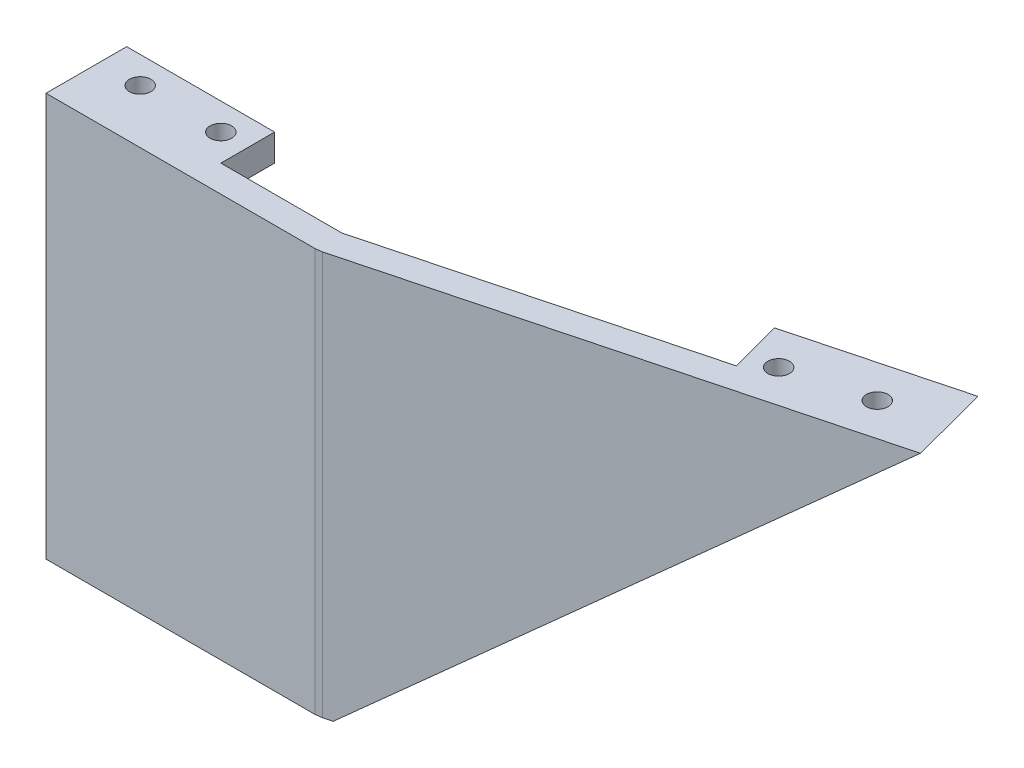
ISO-10303-21;
HEADER;
FILE_DESCRIPTION(('STEP AP214'),'2;1');
FILE_NAME('part.step','',(''),(''),'','','');
FILE_SCHEMA(('AUTOMOTIVE_DESIGN { 1 0 10303 214 1 1 1 1 }'));
ENDSEC;
DATA;
#1=APPLICATION_CONTEXT('core data for automotive mechanical design processes');
#2=APPLICATION_PROTOCOL_DEFINITION('international standard','automotive_design',2000,#1);
#3=PRODUCT_CONTEXT('',#1,'mechanical');
#4=PRODUCT('Part','Part','',(#3));
#5=PRODUCT_RELATED_PRODUCT_CATEGORY('part','',(#4));
#6=PRODUCT_DEFINITION_FORMATION('','',#4);
#7=PRODUCT_DEFINITION_CONTEXT('part definition',#1,'design');
#8=PRODUCT_DEFINITION('design','',#6,#7);
#9=PRODUCT_DEFINITION_SHAPE('','',#8);
#10=(LENGTH_UNIT() NAMED_UNIT(*) SI_UNIT(.MILLI.,.METRE.));
#11=(NAMED_UNIT(*) PLANE_ANGLE_UNIT() SI_UNIT($,.RADIAN.));
#12=(NAMED_UNIT(*) SI_UNIT($,.STERADIAN.) SOLID_ANGLE_UNIT());
#13=UNCERTAINTY_MEASURE_WITH_UNIT(LENGTH_MEASURE(1.E-05),#10,'distance_accuracy_value','');
#14=(GEOMETRIC_REPRESENTATION_CONTEXT(3) GLOBAL_UNCERTAINTY_ASSIGNED_CONTEXT((#13)) GLOBAL_UNIT_ASSIGNED_CONTEXT((#10,
#11,#12)) REPRESENTATION_CONTEXT('',''));
#15=CARTESIAN_POINT('',(0.,0.,0.));
#16=DIRECTION('',(0.,0.,1.));
#17=DIRECTION('',(1.,0.,0.));
#18=AXIS2_PLACEMENT_3D('',#15,#16,#17);
#19=CARTESIAN_POINT('',(0.,65.,0.));
#20=DIRECTION('',(0.,-1.,0.));
#21=DIRECTION('',(0.,0.,-1.));
#22=AXIS2_PLACEMENT_3D('',#19,#20,#21);
#23=PLANE('',#22);
#24=DIRECTION('',(0.,0.,1.));
#25=VECTOR('',#24,1.);
#26=CARTESIAN_POINT('',(-19.9999999999999,65.,-20.));
#27=LINE('',#26,#25);
#28=CARTESIAN_POINT('',(-19.9999999999999,65.,-20.));
#29=VERTEX_POINT('',#28);
#30=CARTESIAN_POINT('',(-19.9999999999999,65.,0.));
#31=VERTEX_POINT('',#30);
#32=EDGE_CURVE('E147',#29,#31,#27,.T.);
#33=ORIENTED_EDGE('',*,*,#32,.T.);
#34=DIRECTION('',(1.,0.,0.));
#35=VECTOR('',#34,1.);
#36=CARTESIAN_POINT('',(-25.,65.,0.));
#37=LINE('',#36,#35);
#38=CARTESIAN_POINT('',(-75.,65.,0.));
#39=VERTEX_POINT('',#38);
#40=EDGE_CURVE('E162',#39,#31,#37,.T.);
#41=ORIENTED_EDGE('',*,*,#40,.F.);
#42=DIRECTION('',(0.,0.,1.));
#43=VECTOR('',#42,1.);
#44=CARTESIAN_POINT('',(-75.,65.,-20.));
#45=LINE('',#44,#43);
#46=CARTESIAN_POINT('',(-75.,65.,-20.));
#47=VERTEX_POINT('',#46);
#48=EDGE_CURVE('E364',#47,#39,#45,.T.);
#49=ORIENTED_EDGE('',*,*,#48,.F.);
#50=DIRECTION('',(-1.,0.,0.));
#51=VECTOR('',#50,1.);
#52=CARTESIAN_POINT('',(-25.,65.,-20.));
#53=LINE('',#52,#51);
#54=EDGE_CURVE('E164',#29,#47,#53,.T.);
#55=ORIENTED_EDGE('',*,*,#54,.F.);
#56=EDGE_LOOP('',(#33,#41,#49,#55));
#57=FACE_BOUND('',#56,.T.);
#58=CARTESIAN_POINT('',(-30.,65.,-10.));
#59=DIRECTION('',(0.,-1.,0.));
#60=DIRECTION('',(0.,0.,-1.));
#61=AXIS2_PLACEMENT_3D('',#58,#59,#60);
#62=CIRCLE('',#61,4.);
#63=CARTESIAN_POINT('',(-30.,65.,-14.));
#64=VERTEX_POINT('',#63);
#65=EDGE_CURVE('E344',#64,#64,#62,.T.);
#66=ORIENTED_EDGE('',*,*,#65,.F.);
#67=EDGE_LOOP('',(#66));
#68=FACE_BOUND('',#67,.T.);
#69=CARTESIAN_POINT('',(-60.,65.,-10.));
#70=DIRECTION('',(0.,-1.,0.));
#71=DIRECTION('',(0.,0.,-1.));
#72=AXIS2_PLACEMENT_3D('',#69,#70,#71);
#73=CIRCLE('',#72,4.00000000000001);
#74=CARTESIAN_POINT('',(-60.,65.,-14.));
#75=VERTEX_POINT('',#74);
#76=EDGE_CURVE('E347',#75,#75,#73,.T.);
#77=ORIENTED_EDGE('',*,*,#76,.F.);
#78=EDGE_LOOP('',(#77));
#79=FACE_BOUND('',#78,.T.);
#80=ADVANCED_FACE('F46',(#57,#68,#79),#23,.T.);
#81=CARTESIAN_POINT('',(-25.,75.,10.));
#82=DIRECTION('',(0.,-1.,0.));
#83=DIRECTION('',(0.,0.,-1.));
#84=AXIS2_PLACEMENT_3D('',#81,#82,#83);
#85=PLANE('',#84);
#86=CARTESIAN_POINT('',(-60.,75.,-10.));
#87=DIRECTION('',(0.,-1.,0.));
#88=DIRECTION('',(0.,0.,-1.));
#89=AXIS2_PLACEMENT_3D('',#86,#87,#88);
#90=CIRCLE('',#89,4.00000000000001);
#91=CARTESIAN_POINT('',(-60.,75.,-14.));
#92=VERTEX_POINT('',#91);
#93=EDGE_CURVE('E361',#92,#92,#90,.T.);
#94=ORIENTED_EDGE('',*,*,#93,.T.);
#95=EDGE_LOOP('',(#94));
#96=FACE_BOUND('',#95,.T.);
#97=CARTESIAN_POINT('',(149.447223347746,75.,-37.919501592667));
#98=DIRECTION('',(0.,-1.,0.));
#99=DIRECTION('',(0.,0.,-1.));
#100=AXIS2_PLACEMENT_3D('',#97,#98,#99);
#101=CIRCLE('',#100,3.99999999999999);
#102=CARTESIAN_POINT('',(149.447223347746,75.,-41.919501592667));
#103=VERTEX_POINT('',#102);
#104=EDGE_CURVE('E358',#103,#103,#101,.T.);
#105=ORIENTED_EDGE('',*,*,#104,.T.);
#106=EDGE_LOOP('',(#105));
#107=FACE_BOUND('',#106,.T.);
#108=CARTESIAN_POINT('',(178.459459465625,75.,-45.5543005710563));
#109=DIRECTION('',(0.,-1.,0.));
#110=DIRECTION('',(0.,0.,-1.));
#111=AXIS2_PLACEMENT_3D('',#108,#109,#110);
#112=CIRCLE('',#111,3.99999999999999);
#113=CARTESIAN_POINT('',(178.459459465625,75.,-49.5543005710563));
#114=VERTEX_POINT('',#113);
#115=EDGE_CURVE('E355',#114,#114,#112,.T.);
#116=ORIENTED_EDGE('',*,*,#115,.T.);
#117=EDGE_LOOP('',(#116));
#118=FACE_BOUND('',#117,.T.);
#119=CARTESIAN_POINT('',(-30.,75.,-10.));
#120=DIRECTION('',(0.,-1.,0.));
#121=DIRECTION('',(0.,0.,-1.));
#122=AXIS2_PLACEMENT_3D('',#119,#120,#121);
#123=CIRCLE('',#122,4.);
#124=CARTESIAN_POINT('',(-30.,75.,-14.));
#125=VERTEX_POINT('',#124);
#126=EDGE_CURVE('E352',#125,#125,#123,.T.);
#127=ORIENTED_EDGE('',*,*,#126,.T.);
#128=EDGE_LOOP('',(#127));
#129=FACE_BOUND('',#128,.T.);
#130=DIRECTION('',(1.,0.,0.));
#131=VECTOR('',#130,1.);
#132=CARTESIAN_POINT('',(-19.9999999999999,75.,0.));
#133=LINE('',#132,#131);
#134=CARTESIAN_POINT('',(-19.9999999999999,75.,0.));
#135=VERTEX_POINT('',#134);
#136=CARTESIAN_POINT('',(25.0000000000001,75.,0.));
#137=VERTEX_POINT('',#136);
#138=EDGE_CURVE('E283',#135,#137,#133,.T.);
#139=ORIENTED_EDGE('',*,*,#138,.F.);
#140=DIRECTION('',(0.,0.,1.));
#141=VECTOR('',#140,1.);
#142=CARTESIAN_POINT('',(-19.9999999999999,75.,-20.));
#143=LINE('',#142,#141);
#144=CARTESIAN_POINT('',(-19.9999999999999,75.,-20.));
#145=VERTEX_POINT('',#144);
#146=EDGE_CURVE('E150',#145,#135,#143,.T.);
#147=ORIENTED_EDGE('',*,*,#146,.F.);
#148=DIRECTION('',(-1.,0.,0.));
#149=VECTOR('',#148,1.);
#150=CARTESIAN_POINT('',(-25.,75.,-20.));
#151=LINE('',#150,#149);
#152=CARTESIAN_POINT('',(-75.,75.,-20.));
#153=VERTEX_POINT('',#152);
#154=EDGE_CURVE('E171',#145,#153,#151,.T.);
#155=ORIENTED_EDGE('',*,*,#154,.T.);
#156=DIRECTION('',(0.,0.,-1.));
#157=VECTOR('',#156,1.);
#158=CARTESIAN_POINT('',(-75.,75.,10.));
#159=LINE('',#158,#157);
#160=CARTESIAN_POINT('',(-75.,75.,10.));
#161=VERTEX_POINT('',#160);
#162=EDGE_CURVE('E371',#161,#153,#159,.T.);
#163=ORIENTED_EDGE('',*,*,#162,.F.);
#164=DIRECTION('',(-1.,0.,0.));
#165=VECTOR('',#164,1.);
#166=CARTESIAN_POINT('',(-25.,75.,10.));
#167=LINE('',#166,#165);
#168=CARTESIAN_POINT('',(25.,75.,10.));
#169=VERTEX_POINT('',#168);
#170=EDGE_CURVE('E293',#169,#161,#167,.T.);
#171=ORIENTED_EDGE('',*,*,#170,.F.);
#172=DIRECTION('',(0.991734474862763,0.,-0.12830717582692));
#173=VECTOR('',#172,1.);
#174=CARTESIAN_POINT('',(25.,75.,10.));
#175=LINE('',#174,#173);
#176=CARTESIAN_POINT('',(27.5449329927964,75.,9.67074537262646));
#177=VERTEX_POINT('',#176);
#178=EDGE_CURVE('E191',#169,#177,#175,.T.);
#179=ORIENTED_EDGE('',*,*,#178,.T.);
#180=DIRECTION('',(-0.967074537262646,0.,0.254493299279644));
#181=VECTOR('',#180,1.);
#182=CARTESIAN_POINT('',(298.325803426337,75.,-61.5873784256738));
#183=LINE('',#182,#181);
#184=CARTESIAN_POINT('',(203.472749868338,75.,-36.6260485419897));
#185=VERTEX_POINT('',#184);
#186=EDGE_CURVE('E260',#185,#177,#183,.T.);
#187=ORIENTED_EDGE('',*,*,#186,.F.);
#188=DIRECTION('',(-0.254493299279644,0.,-0.967074537262646));
#189=VECTOR('',#188,1.);
#190=CARTESIAN_POINT('',(200.150614803003,75.,-49.2501617902638));
#191=LINE('',#190,#189);
#192=CARTESIAN_POINT('',(195.837950889948,75.,-65.6382846598691));
#193=VERTEX_POINT('',#192);
#194=EDGE_CURVE('E381',#185,#193,#191,.T.);
#195=ORIENTED_EDGE('',*,*,#194,.T.);
#196=DIRECTION('',(-0.967074537262646,0.,0.254493299279644));
#197=VECTOR('',#196,1.);
#198=CARTESIAN_POINT('',(22.412469182446,75.,-20.));
#199=LINE('',#198,#197);
#200=CARTESIAN_POINT('',(135.959078485925,75.,-49.8806866588103));
#201=VERTEX_POINT('',#200);
#202=EDGE_CURVE('E175',#193,#201,#199,.T.);
#203=ORIENTED_EDGE('',*,*,#202,.T.);
#204=DIRECTION('',(-0.254493299279646,0.,-0.967074537262646));
#205=VECTOR('',#204,1.);
#206=CARTESIAN_POINT('',(141.048944471518,75.,-30.5391959135574));
#207=LINE('',#206,#205);
#208=CARTESIAN_POINT('',(141.048944471518,75.,-30.5391959135574));
#209=VERTEX_POINT('',#208);
#210=EDGE_CURVE('E165',#209,#201,#207,.T.);
#211=ORIENTED_EDGE('',*,*,#210,.F.);
#212=DIRECTION('',(0.967074537262646,0.,-0.254493299279645));
#213=VECTOR('',#212,1.);
#214=CARTESIAN_POINT('',(25.0000000000001,75.,0.));
#215=LINE('',#214,#213);
#216=EDGE_CURVE('E447',#137,#209,#215,.T.);
#217=ORIENTED_EDGE('',*,*,#216,.F.);
#218=EDGE_LOOP('',(#139,#147,#155,#163,#171,#179,#187,#195,#203,#211,#217));
#219=FACE_BOUND('',#218,.T.);
#220=ADVANCED_FACE('F48',(#96,#107,#118,#129,#219),#85,.F.);
#221=CARTESIAN_POINT('',(-25.,-75.,10.));
#222=DIRECTION('',(0.,1.,0.));
#223=DIRECTION('',(0.,0.,1.));
#224=AXIS2_PLACEMENT_3D('',#221,#222,#223);
#225=PLANE('',#224);
#226=DIRECTION('',(-0.967074537262646,0.,0.254493299279644));
#227=VECTOR('',#226,1.);
#228=CARTESIAN_POINT('',(295.780870433541,-75.,-71.2581237983003));
#229=LINE('',#228,#227);
#230=CARTESIAN_POINT('',(28.0506337621707,-75.,-0.802798358465976));
#231=VERTEX_POINT('',#230);
#232=CARTESIAN_POINT('',(25.,-75.,0.));
#233=VERTEX_POINT('',#232);
#234=EDGE_CURVE('E51',#231,#233,#229,.T.);
#235=ORIENTED_EDGE('',*,*,#234,.F.);
#236=DIRECTION('',(0.254493299279644,0.,0.967074537262646));
#237=VECTOR('',#236,1.);
#238=CARTESIAN_POINT('',(27.2734316896318,-75.,-3.75616623411362));
#239=LINE('',#238,#237);
#240=CARTESIAN_POINT('',(30.595566754967,-75.,8.86794701416049));
#241=VERTEX_POINT('',#240);
#242=EDGE_CURVE('E380',#231,#241,#239,.T.);
#243=ORIENTED_EDGE('',*,*,#242,.T.);
#244=DIRECTION('',(-0.967074537262646,0.,0.254493299279644));
#245=VECTOR('',#244,1.);
#246=CARTESIAN_POINT('',(298.325803426337,-75.,-61.5873784256738));
#247=LINE('',#246,#245);
#248=CARTESIAN_POINT('',(27.5449329927965,-75.,9.67074537262645));
#249=VERTEX_POINT('',#248);
#250=EDGE_CURVE('E262',#241,#249,#247,.T.);
#251=ORIENTED_EDGE('',*,*,#250,.T.);
#252=DIRECTION('',(0.991734474862764,0.,-0.128307175826911));
#253=VECTOR('',#252,1.);
#254=CARTESIAN_POINT('',(25.,-75.,10.));
#255=LINE('',#254,#253);
#256=CARTESIAN_POINT('',(25.,-75.,10.));
#257=VERTEX_POINT('',#256);
#258=EDGE_CURVE('E196',#257,#249,#255,.T.);
#259=ORIENTED_EDGE('',*,*,#258,.F.);
#260=DIRECTION('',(1.,0.,0.));
#261=VECTOR('',#260,1.);
#262=CARTESIAN_POINT('',(-25.,-75.,10.));
#263=LINE('',#262,#261);
#264=CARTESIAN_POINT('',(-75.,-75.,10.));
#265=VERTEX_POINT('',#264);
#266=EDGE_CURVE('E57',#265,#257,#263,.T.);
#267=ORIENTED_EDGE('',*,*,#266,.F.);
#268=DIRECTION('',(0.,0.,1.));
#269=VECTOR('',#268,1.);
#270=CARTESIAN_POINT('',(-75.,-75.,0.));
#271=LINE('',#270,#269);
#272=CARTESIAN_POINT('',(-75.,-75.,0.));
#273=VERTEX_POINT('',#272);
#274=EDGE_CURVE('E281',#273,#265,#271,.T.);
#275=ORIENTED_EDGE('',*,*,#274,.F.);
#276=DIRECTION('',(1.,0.,0.));
#277=VECTOR('',#276,1.);
#278=CARTESIAN_POINT('',(-25.,-75.,0.));
#279=LINE('',#278,#277);
#280=EDGE_CURVE('E278',#273,#233,#279,.T.);
#281=ORIENTED_EDGE('',*,*,#280,.T.);
#282=EDGE_LOOP('',(#235,#243,#251,#259,#267,#275,#281));
#283=FACE_BOUND('',#282,.T.);
#284=ADVANCED_FACE('F279',(#283),#225,.F.);
#285=CARTESIAN_POINT('',(0.,0.,10.));
#286=DIRECTION('',(0.,0.,1.));
#287=DIRECTION('',(1.,0.,0.));
#288=AXIS2_PLACEMENT_3D('',#285,#286,#287);
#289=PLANE('',#288);
#290=DIRECTION('',(0.,1.,0.));
#291=VECTOR('',#290,1.);
#292=CARTESIAN_POINT('',(25.,0.,10.));
#293=LINE('',#292,#291);
#294=EDGE_CURVE('E257',#257,#169,#293,.T.);
#295=ORIENTED_EDGE('',*,*,#294,.T.);
#296=ORIENTED_EDGE('',*,*,#170,.T.);
#297=DIRECTION('',(0.,1.,0.));
#298=VECTOR('',#297,1.);
#299=CARTESIAN_POINT('',(-75.,-75.,10.));
#300=LINE('',#299,#298);
#301=EDGE_CURVE('E368',#265,#161,#300,.T.);
#302=ORIENTED_EDGE('',*,*,#301,.F.);
#303=ORIENTED_EDGE('',*,*,#266,.T.);
#304=EDGE_LOOP('',(#295,#296,#302,#303));
#305=FACE_BOUND('',#304,.T.);
#306=ADVANCED_FACE('F230',(#305),#289,.T.);
#307=CARTESIAN_POINT('',(0.,0.,0.));
#308=DIRECTION('',(0.,0.,1.));
#309=DIRECTION('',(1.,0.,0.));
#310=AXIS2_PLACEMENT_3D('',#307,#308,#309);
#311=PLANE('',#310);
#312=ORIENTED_EDGE('',*,*,#280,.F.);
#313=DIRECTION('',(0.,-1.,0.));
#314=VECTOR('',#313,1.);
#315=CARTESIAN_POINT('',(-75.,65.,0.));
#316=LINE('',#315,#314);
#317=EDGE_CURVE('E169',#39,#273,#316,.T.);
#318=ORIENTED_EDGE('',*,*,#317,.F.);
#319=ORIENTED_EDGE('',*,*,#40,.T.);
#320=DIRECTION('',(0.,1.,0.));
#321=VECTOR('',#320,1.);
#322=CARTESIAN_POINT('',(-19.9999999999999,65.,0.));
#323=LINE('',#322,#321);
#324=EDGE_CURVE('E144',#31,#135,#323,.T.);
#325=ORIENTED_EDGE('',*,*,#324,.T.);
#326=ORIENTED_EDGE('',*,*,#138,.T.);
#327=DIRECTION('',(0.,1.,0.));
#328=VECTOR('',#327,1.);
#329=CARTESIAN_POINT('',(25.,75.,0.));
#330=LINE('',#329,#328);
#331=EDGE_CURVE('E275',#233,#137,#330,.T.);
#332=ORIENTED_EDGE('',*,*,#331,.F.);
#333=EDGE_LOOP('',(#312,#318,#319,#325,#326,#332));
#334=FACE_BOUND('',#333,.T.);
#335=ADVANCED_FACE('F167',(#334),#311,.F.);
#336=CARTESIAN_POINT('',(1.68403478061521,0.,13.0165389273089));
#337=DIRECTION('',(0.128307175826911,0.,0.991734474862764));
#338=DIRECTION('',(0.991734474862764,0.,-0.128307175826911));
#339=AXIS2_PLACEMENT_3D('',#336,#337,#338);
#340=PLANE('',#339);
#341=ORIENTED_EDGE('',*,*,#258,.T.);
#342=DIRECTION('',(0.,1.,0.));
#343=VECTOR('',#342,1.);
#344=CARTESIAN_POINT('',(27.5449329927965,75.,9.67074537262643));
#345=LINE('',#344,#343);
#346=EDGE_CURVE('E195',#249,#177,#345,.T.);
#347=ORIENTED_EDGE('',*,*,#346,.T.);
#348=ORIENTED_EDGE('',*,*,#178,.F.);
#349=ORIENTED_EDGE('',*,*,#294,.F.);
#350=EDGE_LOOP('',(#341,#347,#348,#349));
#351=FACE_BOUND('',#350,.T.);
#352=ADVANCED_FACE('F225',(#351),#340,.T.);
#353=CARTESIAN_POINT('',(295.780870433541,75.,-71.2581237983003));
#354=DIRECTION('',(0.254493299279644,0.,0.967074537262646));
#355=DIRECTION('',(0.967074537262646,0.,-0.254493299279644));
#356=AXIS2_PLACEMENT_3D('',#353,#354,#355);
#357=PLANE('',#356);
#358=ORIENTED_EDGE('',*,*,#331,.T.);
#359=ORIENTED_EDGE('',*,*,#216,.T.);
#360=DIRECTION('',(0.,1.,0.));
#361=VECTOR('',#360,1.);
#362=CARTESIAN_POINT('',(141.048944471518,65.,-30.5391959135574));
#363=LINE('',#362,#361);
#364=CARTESIAN_POINT('',(141.048944471518,65.,-30.5391959135574));
#365=VERTEX_POINT('',#364);
#366=EDGE_CURVE('E155',#365,#209,#363,.T.);
#367=ORIENTED_EDGE('',*,*,#366,.F.);
#368=DIRECTION('',(0.967074537262646,0.,-0.254493299279644));
#369=VECTOR('',#368,1.);
#370=CARTESIAN_POINT('',(25.,65.,0.));
#371=LINE('',#370,#369);
#372=CARTESIAN_POINT('',(189.40267133465,65.,-43.2638608775395));
#373=VERTEX_POINT('',#372);
#374=EDGE_CURVE('E65',#365,#373,#371,.T.);
#375=ORIENTED_EDGE('',*,*,#374,.T.);
#376=DIRECTION('',(-0.740822075351906,-0.642787609686541,0.194953177724186));
#377=VECTOR('',#376,1.);
#378=CARTESIAN_POINT('',(256.589873602786,123.296185527337,-60.9447035796806));
#379=LINE('',#378,#377);
#380=EDGE_CURVE('E276',#373,#231,#379,.T.);
#381=ORIENTED_EDGE('',*,*,#380,.T.);
#382=ORIENTED_EDGE('',*,*,#234,.T.);
#383=EDGE_LOOP('',(#358,#359,#367,#375,#381,#382));
#384=FACE_BOUND('',#383,.T.);
#385=ADVANCED_FACE('F220',(#384),#357,.F.);
#386=CARTESIAN_POINT('',(298.325803426337,75.,-61.5873784256738));
#387=DIRECTION('',(-0.254493299279644,0.,-0.967074537262646));
#388=DIRECTION('',(-0.967074537262646,0.,0.254493299279644));
#389=AXIS2_PLACEMENT_3D('',#386,#387,#388);
#390=PLANE('',#389);
#391=ORIENTED_EDGE('',*,*,#250,.F.);
#392=DIRECTION('',(0.740822075351906,0.642787609686541,-0.194953177724186));
#393=VECTOR('',#392,1.);
#394=CARTESIAN_POINT('',(259.134806595583,123.296185527337,-51.2739582070541));
#395=LINE('',#394,#393);
#396=EDGE_CURVE('E178',#241,#185,#395,.T.);
#397=ORIENTED_EDGE('',*,*,#396,.T.);
#398=ORIENTED_EDGE('',*,*,#186,.T.);
#399=ORIENTED_EDGE('',*,*,#346,.F.);
#400=EDGE_LOOP('',(#391,#397,#398,#399));
#401=FACE_BOUND('',#400,.T.);
#402=ADVANCED_FACE('F209',(#401),#390,.F.);
#403=CARTESIAN_POINT('',(-25.,65.,-20.));
#404=DIRECTION('',(0.,0.,-1.));
#405=DIRECTION('',(-1.,0.,0.));
#406=AXIS2_PLACEMENT_3D('',#403,#404,#405);
#407=PLANE('',#406);
#408=DIRECTION('',(0.,1.,0.));
#409=VECTOR('',#408,1.);
#410=CARTESIAN_POINT('',(-19.9999999999999,65.,-20.));
#411=LINE('',#410,#409);
#412=EDGE_CURVE('E349',#29,#145,#411,.T.);
#413=ORIENTED_EDGE('',*,*,#412,.F.);
#414=ORIENTED_EDGE('',*,*,#54,.T.);
#415=DIRECTION('',(0.,-1.,0.));
#416=VECTOR('',#415,1.);
#417=CARTESIAN_POINT('',(-75.,75.,-20.));
#418=LINE('',#417,#416);
#419=EDGE_CURVE('E374',#153,#47,#418,.T.);
#420=ORIENTED_EDGE('',*,*,#419,.F.);
#421=ORIENTED_EDGE('',*,*,#154,.F.);
#422=EDGE_LOOP('',(#413,#414,#420,#421));
#423=FACE_BOUND('',#422,.T.);
#424=ADVANCED_FACE('F219',(#423),#407,.T.);
#425=CARTESIAN_POINT('',(22.412469182446,65.,-20.));
#426=DIRECTION('',(-0.254493299279644,0.,-0.967074537262646));
#427=DIRECTION('',(-0.967074537262647,0.,0.254493299279644));
#428=AXIS2_PLACEMENT_3D('',#425,#426,#427);
#429=PLANE('',#428);
#430=DIRECTION('',(0.,1.,0.));
#431=VECTOR('',#430,1.);
#432=CARTESIAN_POINT('',(135.959078485925,65.,-49.8806866588103));
#433=LINE('',#432,#431);
#434=CARTESIAN_POINT('',(135.959078485925,65.,-49.8806866588103));
#435=VERTEX_POINT('',#434);
#436=EDGE_CURVE('E399',#435,#201,#433,.T.);
#437=ORIENTED_EDGE('',*,*,#436,.T.);
#438=ORIENTED_EDGE('',*,*,#202,.F.);
#439=DIRECTION('',(0.740822075351906,0.642787609686541,-0.194953177724186));
#440=VECTOR('',#439,1.);
#441=CARTESIAN_POINT('',(89.3057880962541,-17.4345488008952,-37.6035049773179));
#442=LINE('',#441,#440);
#443=CARTESIAN_POINT('',(184.312805349057,65.,-62.6053516227924));
#444=VERTEX_POINT('',#443);
#445=EDGE_CURVE('E377',#444,#193,#442,.T.);
#446=ORIENTED_EDGE('',*,*,#445,.F.);
#447=DIRECTION('',(-0.967074537262646,0.,0.254493299279644));
#448=VECTOR('',#447,1.);
#449=CARTESIAN_POINT('',(22.412469182446,65.,-20.));
#450=LINE('',#449,#448);
#451=EDGE_CURVE('E173',#444,#435,#450,.T.);
#452=ORIENTED_EDGE('',*,*,#451,.T.);
#453=EDGE_LOOP('',(#437,#438,#446,#452));
#454=FACE_BOUND('',#453,.T.);
#455=ADVANCED_FACE('F221',(#454),#429,.T.);
#456=DIRECTION('',(-0.254493299279646,0.,-0.967074537262646));
#457=VECTOR('',#456,1.);
#458=CARTESIAN_POINT('',(141.048944471518,65.,-30.5391959135574));
#459=LINE('',#458,#457);
#460=EDGE_CURVE('E156',#365,#435,#459,.T.);
#461=ORIENTED_EDGE('',*,*,#460,.T.);
#462=ORIENTED_EDGE('',*,*,#451,.F.);
#463=DIRECTION('',(-0.254493299279644,0.,-0.967074537262646));
#464=VECTOR('',#463,1.);
#465=CARTESIAN_POINT('',(187.783500350194,65.,-49.4167106184721));
#466=LINE('',#465,#464);
#467=EDGE_CURVE('E12',#373,#444,#466,.T.);
#468=ORIENTED_EDGE('',*,*,#467,.F.);
#469=ORIENTED_EDGE('',*,*,#374,.F.);
#470=EDGE_LOOP('',(#461,#462,#468,#469));
#471=FACE_BOUND('',#470,.T.);
#472=CARTESIAN_POINT('',(149.447223347746,65.,-37.919501592667));
#473=DIRECTION('',(0.,-1.,0.));
#474=DIRECTION('',(0.,0.,-1.));
#475=AXIS2_PLACEMENT_3D('',#472,#473,#474);
#476=CIRCLE('',#475,3.99999999999999);
#477=CARTESIAN_POINT('',(149.447223347746,65.,-41.919501592667));
#478=VERTEX_POINT('',#477);
#479=EDGE_CURVE('E339',#478,#478,#476,.T.);
#480=ORIENTED_EDGE('',*,*,#479,.F.);
#481=EDGE_LOOP('',(#480));
#482=FACE_BOUND('',#481,.T.);
#483=CARTESIAN_POINT('',(178.459459465625,65.,-45.5543005710563));
#484=DIRECTION('',(0.,-1.,0.));
#485=DIRECTION('',(0.,0.,-1.));
#486=AXIS2_PLACEMENT_3D('',#483,#484,#485);
#487=CIRCLE('',#486,3.99999999999999);
#488=CARTESIAN_POINT('',(178.459459465625,65.,-49.5543005710563));
#489=VERTEX_POINT('',#488);
#490=EDGE_CURVE('E342',#489,#489,#487,.T.);
#491=ORIENTED_EDGE('',*,*,#490,.F.);
#492=EDGE_LOOP('',(#491));
#493=FACE_BOUND('',#492,.T.);
#494=ADVANCED_FACE('F316',(#471,#482,#493),#23,.T.);
#495=CARTESIAN_POINT('',(202.127336298632,65.,5.08986598559286));
#496=DIRECTION('',(-0.621623530195774,0.766044443118977,0.163585139525204));
#497=DIRECTION('',(-0.776504565202097,-0.630111625206441,0.));
#498=AXIS2_PLACEMENT_3D('',#495,#496,#497);
#499=PLANE('',#498);
#500=ORIENTED_EDGE('',*,*,#242,.F.);
#501=ORIENTED_EDGE('',*,*,#380,.F.);
#502=ORIENTED_EDGE('',*,*,#467,.T.);
#503=ORIENTED_EDGE('',*,*,#445,.T.);
#504=ORIENTED_EDGE('',*,*,#194,.F.);
#505=ORIENTED_EDGE('',*,*,#396,.F.);
#506=EDGE_LOOP('',(#500,#501,#502,#503,#504,#505));
#507=FACE_BOUND('',#506,.T.);
#508=ADVANCED_FACE('F323',(#507),#499,.F.);
#509=CARTESIAN_POINT('',(-75.,0.,0.));
#510=DIRECTION('',(1.,0.,0.));
#511=DIRECTION('',(0.,0.,-1.));
#512=AXIS2_PLACEMENT_3D('',#509,#510,#511);
#513=PLANE('',#512);
#514=ORIENTED_EDGE('',*,*,#48,.T.);
#515=ORIENTED_EDGE('',*,*,#317,.T.);
#516=ORIENTED_EDGE('',*,*,#274,.T.);
#517=ORIENTED_EDGE('',*,*,#301,.T.);
#518=ORIENTED_EDGE('',*,*,#162,.T.);
#519=ORIENTED_EDGE('',*,*,#419,.T.);
#520=EDGE_LOOP('',(#514,#515,#516,#517,#518,#519));
#521=FACE_BOUND('',#520,.T.);
#522=ADVANCED_FACE('F329',(#521),#513,.F.);
#523=CARTESIAN_POINT('',(-30.,95.,-10.));
#524=DIRECTION('',(0.,-1.,0.));
#525=DIRECTION('',(0.,0.,-1.));
#526=AXIS2_PLACEMENT_3D('',#523,#524,#525);
#527=CYLINDRICAL_SURFACE('',#526,4.);
#528=ORIENTED_EDGE('',*,*,#65,.T.);
#529=EDGE_LOOP('',(#528));
#530=FACE_BOUND('',#529,.T.);
#531=ORIENTED_EDGE('',*,*,#126,.F.);
#532=EDGE_LOOP('',(#531));
#533=FACE_BOUND('',#532,.T.);
#534=ADVANCED_FACE('F424',(#530,#533),#527,.F.);
#535=CARTESIAN_POINT('',(178.459459465625,95.,-45.5543005710563));
#536=DIRECTION('',(0.,-1.,0.));
#537=DIRECTION('',(0.,0.,-1.));
#538=AXIS2_PLACEMENT_3D('',#535,#536,#537);
#539=CYLINDRICAL_SURFACE('',#538,3.99999999999999);
#540=ORIENTED_EDGE('',*,*,#490,.T.);
#541=EDGE_LOOP('',(#540));
#542=FACE_BOUND('',#541,.T.);
#543=ORIENTED_EDGE('',*,*,#115,.F.);
#544=EDGE_LOOP('',(#543));
#545=FACE_BOUND('',#544,.T.);
#546=ADVANCED_FACE('F426',(#542,#545),#539,.F.);
#547=CARTESIAN_POINT('',(149.447223347746,95.,-37.919501592667));
#548=DIRECTION('',(0.,-1.,0.));
#549=DIRECTION('',(0.,0.,-1.));
#550=AXIS2_PLACEMENT_3D('',#547,#548,#549);
#551=CYLINDRICAL_SURFACE('',#550,3.99999999999999);
#552=ORIENTED_EDGE('',*,*,#479,.T.);
#553=EDGE_LOOP('',(#552));
#554=FACE_BOUND('',#553,.T.);
#555=ORIENTED_EDGE('',*,*,#104,.F.);
#556=EDGE_LOOP('',(#555));
#557=FACE_BOUND('',#556,.T.);
#558=ADVANCED_FACE('F414',(#554,#557),#551,.F.);
#559=CARTESIAN_POINT('',(-60.,95.,-10.));
#560=DIRECTION('',(0.,-1.,0.));
#561=DIRECTION('',(0.,0.,-1.));
#562=AXIS2_PLACEMENT_3D('',#559,#560,#561);
#563=CYLINDRICAL_SURFACE('',#562,4.00000000000001);
#564=ORIENTED_EDGE('',*,*,#76,.T.);
#565=EDGE_LOOP('',(#564));
#566=FACE_BOUND('',#565,.T.);
#567=ORIENTED_EDGE('',*,*,#93,.F.);
#568=EDGE_LOOP('',(#567));
#569=FACE_BOUND('',#568,.T.);
#570=ADVANCED_FACE('F410',(#566,#569),#563,.F.);
#571=CARTESIAN_POINT('',(-19.9999999999999,65.,-20.));
#572=DIRECTION('',(-1.,0.,0.));
#573=DIRECTION('',(0.,0.,1.));
#574=AXIS2_PLACEMENT_3D('',#571,#572,#573);
#575=PLANE('',#574);
#576=ORIENTED_EDGE('',*,*,#146,.T.);
#577=ORIENTED_EDGE('',*,*,#324,.F.);
#578=ORIENTED_EDGE('',*,*,#32,.F.);
#579=ORIENTED_EDGE('',*,*,#412,.T.);
#580=EDGE_LOOP('',(#576,#577,#578,#579));
#581=FACE_BOUND('',#580,.T.);
#582=ADVANCED_FACE('F146',(#581),#575,.F.);
#583=CARTESIAN_POINT('',(141.048944471518,65.,-30.5391959135574));
#584=DIRECTION('',(0.967074537262646,0.,-0.254493299279646));
#585=DIRECTION('',(-0.254493299279646,0.,-0.967074537262646));
#586=AXIS2_PLACEMENT_3D('',#583,#584,#585);
#587=PLANE('',#586);
#588=ORIENTED_EDGE('',*,*,#210,.T.);
#589=ORIENTED_EDGE('',*,*,#436,.F.);
#590=ORIENTED_EDGE('',*,*,#460,.F.);
#591=ORIENTED_EDGE('',*,*,#366,.T.);
#592=EDGE_LOOP('',(#588,#589,#590,#591));
#593=FACE_BOUND('',#592,.T.);
#594=ADVANCED_FACE('F441',(#593),#587,.F.);
#595=CLOSED_SHELL('',(#80,#220,#284,#306,#335,#352,#385,#402,#424,#455,#494,#508,#522,#534,#546,
#558,#570,#582,#594));
#596=MANIFOLD_SOLID_BREP('B2',#595);
#597=ADVANCED_BREP_SHAPE_REPRESENTATION('',(#18,#596),#14);
#598=SHAPE_DEFINITION_REPRESENTATION(#9,#597);
ENDSEC;
END-ISO-10303-21;
